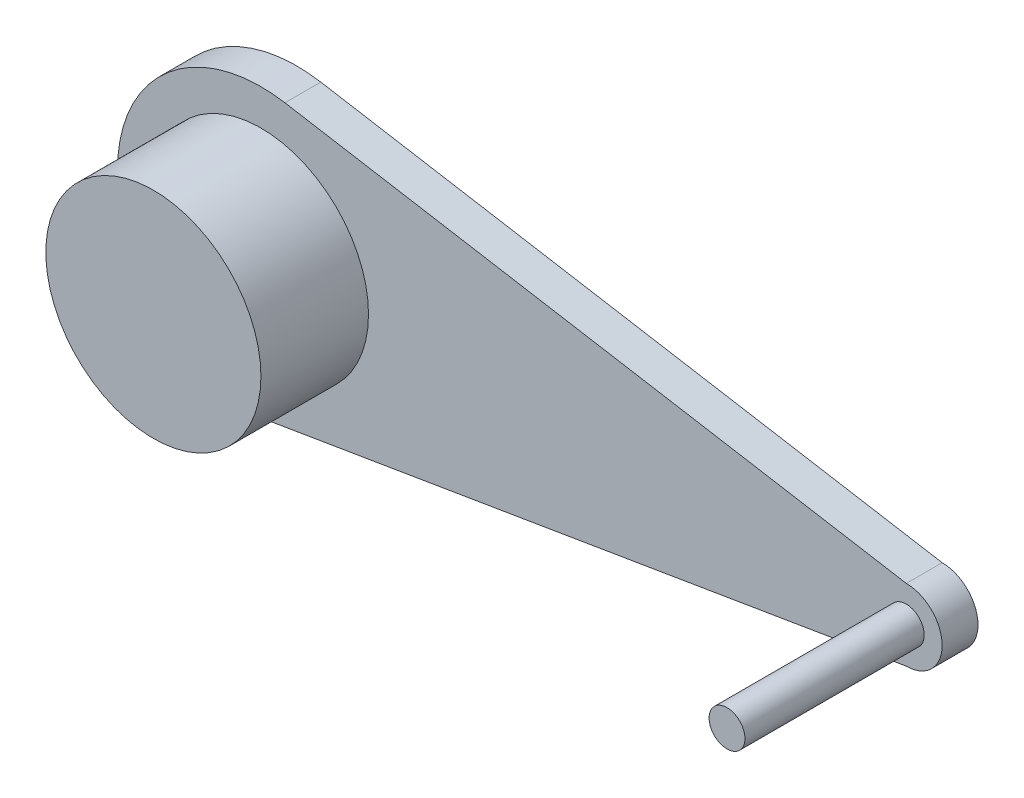
ISO-10303-21;
HEADER;
FILE_DESCRIPTION(('STEP AP214'),'2;1');
FILE_NAME('part.step','',(''),(''),'','','');
FILE_SCHEMA(('AUTOMOTIVE_DESIGN { 1 0 10303 214 1 1 1 1 }'));
ENDSEC;
DATA;
#1=APPLICATION_CONTEXT('core data for automotive mechanical design processes');
#2=APPLICATION_PROTOCOL_DEFINITION('international standard','automotive_design',2000,#1);
#3=PRODUCT_CONTEXT('',#1,'mechanical');
#4=PRODUCT('Part','Part','',(#3));
#5=PRODUCT_RELATED_PRODUCT_CATEGORY('part','',(#4));
#6=PRODUCT_DEFINITION_FORMATION('','',#4);
#7=PRODUCT_DEFINITION_CONTEXT('part definition',#1,'design');
#8=PRODUCT_DEFINITION('design','',#6,#7);
#9=PRODUCT_DEFINITION_SHAPE('','',#8);
#10=(LENGTH_UNIT() NAMED_UNIT(*) SI_UNIT(.MILLI.,.METRE.));
#11=(NAMED_UNIT(*) PLANE_ANGLE_UNIT() SI_UNIT($,.RADIAN.));
#12=(NAMED_UNIT(*) SI_UNIT($,.STERADIAN.) SOLID_ANGLE_UNIT());
#13=UNCERTAINTY_MEASURE_WITH_UNIT(LENGTH_MEASURE(1.E-05),#10,'distance_accuracy_value','');
#14=(GEOMETRIC_REPRESENTATION_CONTEXT(3) GLOBAL_UNCERTAINTY_ASSIGNED_CONTEXT((#13)) GLOBAL_UNIT_ASSIGNED_CONTEXT((#10,
#11,#12)) REPRESENTATION_CONTEXT('',''));
#15=CARTESIAN_POINT('',(0.,0.,0.));
#16=DIRECTION('',(0.,0.,1.));
#17=DIRECTION('',(1.,0.,0.));
#18=AXIS2_PLACEMENT_3D('',#15,#16,#17);
#19=CARTESIAN_POINT('',(18.,0.,1.));
#20=DIRECTION('',(0.,0.,-1.));
#21=DIRECTION('',(-1.,0.,0.));
#22=AXIS2_PLACEMENT_3D('',#19,#20,#21);
#23=CYLINDRICAL_SURFACE('',#22,1.);
#24=CARTESIAN_POINT('',(18.,0.,0.));
#25=DIRECTION('',(0.,0.,1.));
#26=DIRECTION('',(1.,0.,0.));
#27=AXIS2_PLACEMENT_3D('',#24,#25,#26);
#28=CIRCLE('',#27,1.);
#29=CARTESIAN_POINT('',(18.,-1.,0.));
#30=VERTEX_POINT('',#29);
#31=CARTESIAN_POINT('',(18.,1.,0.));
#32=VERTEX_POINT('',#31);
#33=EDGE_CURVE('E101',#30,#32,#28,.T.);
#34=ORIENTED_EDGE('',*,*,#33,.T.);
#35=DIRECTION('',(0.,0.,-1.));
#36=VECTOR('',#35,1.);
#37=CARTESIAN_POINT('',(18.,1.,1.));
#38=LINE('',#37,#36);
#39=CARTESIAN_POINT('',(18.,1.,1.));
#40=VERTEX_POINT('',#39);
#41=EDGE_CURVE('E11',#40,#32,#38,.T.);
#42=ORIENTED_EDGE('',*,*,#41,.F.);
#43=CARTESIAN_POINT('',(18.,0.,1.));
#44=DIRECTION('',(0.,0.,1.));
#45=DIRECTION('',(1.,0.,0.));
#46=AXIS2_PLACEMENT_3D('',#43,#44,#45);
#47=CIRCLE('',#46,1.);
#48=CARTESIAN_POINT('',(18.,-1.,1.));
#49=VERTEX_POINT('',#48);
#50=EDGE_CURVE('E89',#49,#40,#47,.T.);
#51=ORIENTED_EDGE('',*,*,#50,.F.);
#52=DIRECTION('',(0.,0.,-1.));
#53=VECTOR('',#52,1.);
#54=CARTESIAN_POINT('',(18.,-1.,1.));
#55=LINE('',#54,#53);
#56=EDGE_CURVE('E97',#49,#30,#55,.T.);
#57=ORIENTED_EDGE('',*,*,#56,.T.);
#58=EDGE_LOOP('',(#34,#42,#51,#57));
#59=FACE_BOUND('',#58,.T.);
#60=ADVANCED_FACE('F38',(#59),#23,.T.);
#61=CARTESIAN_POINT('',(18.,1.,1.));
#62=DIRECTION('',(-0.167451089750009,-0.985880384499831,0.));
#63=DIRECTION('',(0.985880384499831,-0.167451089750009,0.));
#64=AXIS2_PLACEMENT_3D('',#61,#62,#63);
#65=PLANE('',#64);
#66=DIRECTION('',(-0.985880384499831,0.167451089750009,0.));
#67=VECTOR('',#66,1.);
#68=CARTESIAN_POINT('',(18.,1.,0.));
#69=LINE('',#68,#67);
#70=CARTESIAN_POINT('',(0.669804359000038,3.94352153799932,0.));
#71=VERTEX_POINT('',#70);
#72=EDGE_CURVE('E93',#32,#71,#69,.T.);
#73=ORIENTED_EDGE('',*,*,#72,.T.);
#74=DIRECTION('',(0.,0.,-1.));
#75=VECTOR('',#74,1.);
#76=CARTESIAN_POINT('',(0.669804359000038,3.94352153799932,1.));
#77=LINE('',#76,#75);
#78=CARTESIAN_POINT('',(0.669804359000038,3.94352153799932,1.));
#79=VERTEX_POINT('',#78);
#80=EDGE_CURVE('E46',#79,#71,#77,.T.);
#81=ORIENTED_EDGE('',*,*,#80,.F.);
#82=DIRECTION('',(-0.985880384499831,0.167451089750009,0.));
#83=VECTOR('',#82,1.);
#84=CARTESIAN_POINT('',(18.,1.,1.));
#85=LINE('',#84,#83);
#86=EDGE_CURVE('E84',#40,#79,#85,.T.);
#87=ORIENTED_EDGE('',*,*,#86,.F.);
#88=ORIENTED_EDGE('',*,*,#41,.T.);
#89=EDGE_LOOP('',(#73,#81,#87,#88));
#90=FACE_BOUND('',#89,.T.);
#91=ADVANCED_FACE('F92',(#90),#65,.F.);
#92=CARTESIAN_POINT('',(0.,0.,1.));
#93=DIRECTION('',(0.,0.,-1.));
#94=DIRECTION('',(-1.,0.,0.));
#95=AXIS2_PLACEMENT_3D('',#92,#93,#94);
#96=CYLINDRICAL_SURFACE('',#95,4.);
#97=CARTESIAN_POINT('',(0.,0.,0.));
#98=DIRECTION('',(0.,0.,1.));
#99=DIRECTION('',(1.,0.,0.));
#100=AXIS2_PLACEMENT_3D('',#97,#98,#99);
#101=CIRCLE('',#100,4.);
#102=CARTESIAN_POINT('',(0.,-4.,0.));
#103=VERTEX_POINT('',#102);
#104=EDGE_CURVE('E71',#71,#103,#101,.T.);
#105=ORIENTED_EDGE('',*,*,#104,.T.);
#106=DIRECTION('',(0.,0.,-1.));
#107=VECTOR('',#106,1.);
#108=CARTESIAN_POINT('',(0.,-4.,1.));
#109=LINE('',#108,#107);
#110=CARTESIAN_POINT('',(0.,-4.,1.));
#111=VERTEX_POINT('',#110);
#112=EDGE_CURVE('E94',#111,#103,#109,.T.);
#113=ORIENTED_EDGE('',*,*,#112,.F.);
#114=CARTESIAN_POINT('',(0.,0.,1.));
#115=DIRECTION('',(0.,0.,1.));
#116=DIRECTION('',(1.,0.,0.));
#117=AXIS2_PLACEMENT_3D('',#114,#115,#116);
#118=CIRCLE('',#117,4.);
#119=EDGE_CURVE('E87',#79,#111,#118,.T.);
#120=ORIENTED_EDGE('',*,*,#119,.F.);
#121=ORIENTED_EDGE('',*,*,#80,.T.);
#122=EDGE_LOOP('',(#105,#113,#120,#121));
#123=FACE_BOUND('',#122,.T.);
#124=ADVANCED_FACE('F95',(#123),#96,.T.);
#125=CARTESIAN_POINT('',(18.,-1.,1.));
#126=DIRECTION('',(-0.164398987305357,0.986393923832144,0.));
#127=DIRECTION('',(-0.986393923832144,-0.164398987305357,0.));
#128=AXIS2_PLACEMENT_3D('',#125,#126,#127);
#129=PLANE('',#128);
#130=DIRECTION('',(0.986393923832144,0.164398987305357,0.));
#131=VECTOR('',#130,1.);
#132=CARTESIAN_POINT('',(18.,-1.,0.));
#133=LINE('',#132,#131);
#134=EDGE_CURVE('E77',#103,#30,#133,.T.);
#135=ORIENTED_EDGE('',*,*,#134,.T.);
#136=ORIENTED_EDGE('',*,*,#56,.F.);
#137=DIRECTION('',(0.986393923832144,0.164398987305357,0.));
#138=VECTOR('',#137,1.);
#139=CARTESIAN_POINT('',(18.,-1.,1.));
#140=LINE('',#139,#138);
#141=EDGE_CURVE('E54',#111,#49,#140,.T.);
#142=ORIENTED_EDGE('',*,*,#141,.F.);
#143=ORIENTED_EDGE('',*,*,#112,.T.);
#144=EDGE_LOOP('',(#135,#136,#142,#143));
#145=FACE_BOUND('',#144,.T.);
#146=ADVANCED_FACE('F109',(#145),#129,.F.);
#147=CARTESIAN_POINT('',(18.,0.,1.));
#148=DIRECTION('',(0.,0.,1.));
#149=DIRECTION('',(1.,0.,0.));
#150=AXIS2_PLACEMENT_3D('',#147,#148,#149);
#151=PLANE('',#150);
#152=CARTESIAN_POINT('',(0.,0.,1.));
#153=DIRECTION('',(0.,0.,1.));
#154=DIRECTION('',(1.,0.,0.));
#155=AXIS2_PLACEMENT_3D('',#152,#153,#154);
#156=CIRCLE('',#155,3.);
#157=CARTESIAN_POINT('',(3.,0.,1.));
#158=VERTEX_POINT('',#157);
#159=EDGE_CURVE('E118',#158,#158,#156,.T.);
#160=ORIENTED_EDGE('',*,*,#159,.F.);
#161=EDGE_LOOP('',(#160));
#162=FACE_BOUND('',#161,.T.);
#163=CARTESIAN_POINT('',(18.,0.,1.));
#164=DIRECTION('',(0.,0.,1.));
#165=DIRECTION('',(1.,0.,0.));
#166=AXIS2_PLACEMENT_3D('',#163,#164,#165);
#167=CIRCLE('',#166,0.499999999999999);
#168=CARTESIAN_POINT('',(18.5,0.,1.));
#169=VERTEX_POINT('',#168);
#170=EDGE_CURVE('E104',#169,#169,#167,.T.);
#171=ORIENTED_EDGE('',*,*,#170,.F.);
#172=EDGE_LOOP('',(#171));
#173=FACE_BOUND('',#172,.T.);
#174=ORIENTED_EDGE('',*,*,#50,.T.);
#175=ORIENTED_EDGE('',*,*,#86,.T.);
#176=ORIENTED_EDGE('',*,*,#119,.T.);
#177=ORIENTED_EDGE('',*,*,#141,.T.);
#178=EDGE_LOOP('',(#174,#175,#176,#177));
#179=FACE_BOUND('',#178,.T.);
#180=ADVANCED_FACE('F85',(#162,#173,#179),#151,.T.);
#181=CARTESIAN_POINT('',(18.,0.,0.));
#182=DIRECTION('',(0.,0.,1.));
#183=DIRECTION('',(1.,0.,0.));
#184=AXIS2_PLACEMENT_3D('',#181,#182,#183);
#185=PLANE('',#184);
#186=ORIENTED_EDGE('',*,*,#33,.F.);
#187=ORIENTED_EDGE('',*,*,#134,.F.);
#188=ORIENTED_EDGE('',*,*,#104,.F.);
#189=ORIENTED_EDGE('',*,*,#72,.F.);
#190=EDGE_LOOP('',(#186,#187,#188,#189));
#191=FACE_BOUND('',#190,.T.);
#192=ADVANCED_FACE('F112',(#191),#185,.F.);
#193=CARTESIAN_POINT('',(18.,0.,4.));
#194=DIRECTION('',(0.,0.,-1.));
#195=DIRECTION('',(-1.,0.,0.));
#196=AXIS2_PLACEMENT_3D('',#193,#194,#195);
#197=CYLINDRICAL_SURFACE('',#196,0.499999999999999);
#198=ORIENTED_EDGE('',*,*,#170,.T.);
#199=EDGE_LOOP('',(#198));
#200=FACE_BOUND('',#199,.T.);
#201=CARTESIAN_POINT('',(18.,0.,6.));
#202=DIRECTION('',(0.,0.,1.));
#203=DIRECTION('',(1.,0.,0.));
#204=AXIS2_PLACEMENT_3D('',#201,#202,#203);
#205=CIRCLE('',#204,0.500000000000003);
#206=CARTESIAN_POINT('',(18.5,0.,6.));
#207=VERTEX_POINT('',#206);
#208=EDGE_CURVE('E121',#207,#207,#205,.T.);
#209=ORIENTED_EDGE('',*,*,#208,.F.);
#210=EDGE_LOOP('',(#209));
#211=FACE_BOUND('',#210,.T.);
#212=ADVANCED_FACE('F129',(#200,#211),#197,.T.);
#213=CARTESIAN_POINT('',(0.,0.,4.));
#214=DIRECTION('',(0.,0.,-1.));
#215=DIRECTION('',(-1.,0.,0.));
#216=AXIS2_PLACEMENT_3D('',#213,#214,#215);
#217=CYLINDRICAL_SURFACE('',#216,3.);
#218=CARTESIAN_POINT('',(0.,0.,4.));
#219=DIRECTION('',(0.,0.,1.));
#220=DIRECTION('',(1.,0.,0.));
#221=AXIS2_PLACEMENT_3D('',#218,#219,#220);
#222=CIRCLE('',#221,3.);
#223=CARTESIAN_POINT('',(3.,0.,4.));
#224=VERTEX_POINT('',#223);
#225=EDGE_CURVE('E117',#224,#224,#222,.T.);
#226=ORIENTED_EDGE('',*,*,#225,.F.);
#227=EDGE_LOOP('',(#226));
#228=FACE_BOUND('',#227,.T.);
#229=ORIENTED_EDGE('',*,*,#159,.T.);
#230=EDGE_LOOP('',(#229));
#231=FACE_BOUND('',#230,.T.);
#232=ADVANCED_FACE('F131',(#228,#231),#217,.T.);
#233=CARTESIAN_POINT('',(0.,0.,4.));
#234=DIRECTION('',(0.,0.,1.));
#235=DIRECTION('',(1.,0.,0.));
#236=AXIS2_PLACEMENT_3D('',#233,#234,#235);
#237=PLANE('',#236);
#238=ORIENTED_EDGE('',*,*,#225,.T.);
#239=EDGE_LOOP('',(#238));
#240=FACE_BOUND('',#239,.T.);
#241=ADVANCED_FACE('F139',(#240),#237,.T.);
#242=CARTESIAN_POINT('',(18.,0.,6.));
#243=DIRECTION('',(0.,0.,1.));
#244=DIRECTION('',(1.,0.,0.));
#245=AXIS2_PLACEMENT_3D('',#242,#243,#244);
#246=PLANE('',#245);
#247=ORIENTED_EDGE('',*,*,#208,.T.);
#248=EDGE_LOOP('',(#247));
#249=FACE_BOUND('',#248,.T.);
#250=ADVANCED_FACE('F127',(#249),#246,.T.);
#251=CLOSED_SHELL('',(#60,#91,#124,#146,#180,#192,#212,#232,#241,#250));
#252=MANIFOLD_SOLID_BREP('B2',#251);
#253=ADVANCED_BREP_SHAPE_REPRESENTATION('',(#18,#252),#14);
#254=SHAPE_DEFINITION_REPRESENTATION(#9,#253);
ENDSEC;
END-ISO-10303-21;
